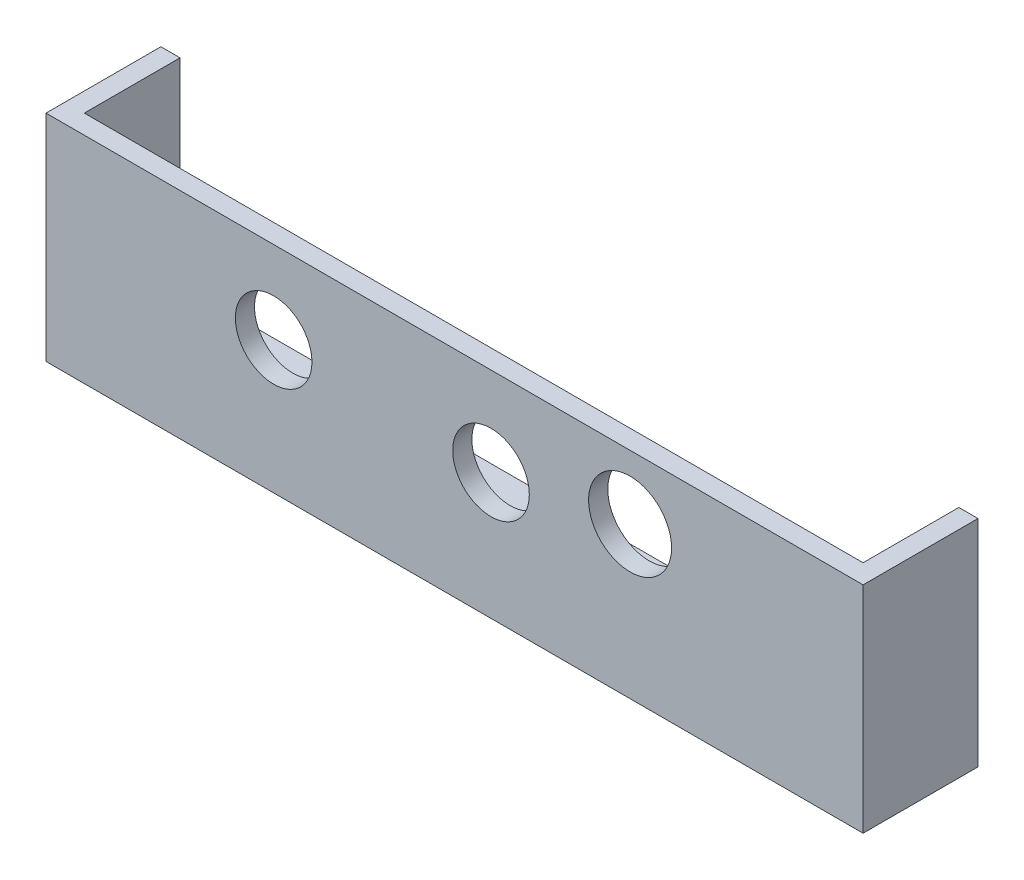
ISO-10303-21;
HEADER;
FILE_DESCRIPTION(('STEP AP214'),'2;1');
FILE_NAME('part.step','',(''),(''),'','','');
FILE_SCHEMA(('AUTOMOTIVE_DESIGN { 1 0 10303 214 1 1 1 1 }'));
ENDSEC;
DATA;
#1=APPLICATION_CONTEXT('core data for automotive mechanical design processes');
#2=APPLICATION_PROTOCOL_DEFINITION('international standard','automotive_design',2000,#1);
#3=PRODUCT_CONTEXT('',#1,'mechanical');
#4=PRODUCT('Part','Part','',(#3));
#5=PRODUCT_RELATED_PRODUCT_CATEGORY('part','',(#4));
#6=PRODUCT_DEFINITION_FORMATION('','',#4);
#7=PRODUCT_DEFINITION_CONTEXT('part definition',#1,'design');
#8=PRODUCT_DEFINITION('design','',#6,#7);
#9=PRODUCT_DEFINITION_SHAPE('','',#8);
#10=(LENGTH_UNIT() NAMED_UNIT(*) SI_UNIT(.MILLI.,.METRE.));
#11=(NAMED_UNIT(*) PLANE_ANGLE_UNIT() SI_UNIT($,.RADIAN.));
#12=(NAMED_UNIT(*) SI_UNIT($,.STERADIAN.) SOLID_ANGLE_UNIT());
#13=UNCERTAINTY_MEASURE_WITH_UNIT(LENGTH_MEASURE(1.E-05),#10,'distance_accuracy_value','');
#14=(GEOMETRIC_REPRESENTATION_CONTEXT(3) GLOBAL_UNCERTAINTY_ASSIGNED_CONTEXT((#13)) GLOBAL_UNIT_ASSIGNED_CONTEXT((#10,
#11,#12)) REPRESENTATION_CONTEXT('',''));
#15=CARTESIAN_POINT('',(0.,0.,0.));
#16=DIRECTION('',(0.,0.,1.));
#17=DIRECTION('',(1.,0.,0.));
#18=AXIS2_PLACEMENT_3D('',#15,#16,#17);
#19=CARTESIAN_POINT('',(0.,0.,0.));
#20=DIRECTION('',(0.,0.,1.));
#21=DIRECTION('',(1.,0.,0.));
#22=AXIS2_PLACEMENT_3D('',#19,#20,#21);
#23=PLANE('',#22);
#24=CARTESIAN_POINT('',(-59.3196683940109,-51.3800722070617,0.));
#25=DIRECTION('',(0.,0.,1.));
#26=DIRECTION('',(1.,0.,0.));
#27=AXIS2_PLACEMENT_3D('',#24,#25,#26);
#28=CIRCLE('',#27,6.);
#29=CARTESIAN_POINT('',(-53.3196683940109,-51.3800722070617,0.));
#30=VERTEX_POINT('',#29);
#31=EDGE_CURVE('E150',#30,#30,#28,.T.);
#32=ORIENTED_EDGE('',*,*,#31,.T.);
#33=EDGE_LOOP('',(#32));
#34=FACE_BOUND('',#33,.T.);
#35=CARTESIAN_POINT('',(-25.269668394011,-52.3300722070617,0.));
#36=DIRECTION('',(0.,0.,1.));
#37=DIRECTION('',(1.,0.,0.));
#38=AXIS2_PLACEMENT_3D('',#35,#36,#37);
#39=CIRCLE('',#38,6.);
#40=CARTESIAN_POINT('',(-19.269668394011,-52.3300722070617,0.));
#41=VERTEX_POINT('',#40);
#42=EDGE_CURVE('E154',#41,#41,#39,.T.);
#43=ORIENTED_EDGE('',*,*,#42,.T.);
#44=EDGE_LOOP('',(#43));
#45=FACE_BOUND('',#44,.T.);
#46=CARTESIAN_POINT('',(-3.4808099724207,-48.4300722070617,0.));
#47=DIRECTION('',(0.,0.,1.));
#48=DIRECTION('',(1.,0.,0.));
#49=AXIS2_PLACEMENT_3D('',#46,#47,#48);
#50=CIRCLE('',#49,6.5);
#51=CARTESIAN_POINT('',(3.0191900275793,-48.4300722070617,0.));
#52=VERTEX_POINT('',#51);
#53=EDGE_CURVE('E160',#52,#52,#50,.T.);
#54=ORIENTED_EDGE('',*,*,#53,.T.);
#55=EDGE_LOOP('',(#54));
#56=FACE_BOUND('',#55,.T.);
#57=DIRECTION('',(0.,1.,0.));
#58=VECTOR('',#57,1.);
#59=CARTESIAN_POINT('',(30.0191899286331,-69.1300722070617,0.));
#60=LINE('',#59,#58);
#61=CARTESIAN_POINT('',(30.0191899286331,-69.1300722070617,0.));
#62=VERTEX_POINT('',#61);
#63=CARTESIAN_POINT('',(30.0191899286331,-38.4300722070617,0.));
#64=VERTEX_POINT('',#63);
#65=EDGE_CURVE('E48',#62,#64,#60,.T.);
#66=ORIENTED_EDGE('',*,*,#65,.F.);
#67=DIRECTION('',(1.,0.,0.));
#68=VECTOR('',#67,1.);
#69=CARTESIAN_POINT('',(-91.9808100713669,-69.1300722070617,0.));
#70=LINE('',#69,#68);
#71=CARTESIAN_POINT('',(-91.9808100713669,-69.1300722070617,0.));
#72=VERTEX_POINT('',#71);
#73=EDGE_CURVE('E124',#72,#62,#70,.T.);
#74=ORIENTED_EDGE('',*,*,#73,.F.);
#75=DIRECTION('',(0.,-1.,0.));
#76=VECTOR('',#75,1.);
#77=CARTESIAN_POINT('',(-91.9808100713669,-38.4300722070617,0.));
#78=LINE('',#77,#76);
#79=CARTESIAN_POINT('',(-91.9808100713669,-38.4300722070617,0.));
#80=VERTEX_POINT('',#79);
#81=EDGE_CURVE('E53',#80,#72,#78,.T.);
#82=ORIENTED_EDGE('',*,*,#81,.F.);
#83=DIRECTION('',(-1.,0.,0.));
#84=VECTOR('',#83,1.);
#85=CARTESIAN_POINT('',(-94.9808100713669,-38.4300722070617,0.));
#86=LINE('',#85,#84);
#87=EDGE_CURVE('E166',#64,#80,#86,.T.);
#88=ORIENTED_EDGE('',*,*,#87,.F.);
#89=EDGE_LOOP('',(#66,#74,#82,#88));
#90=FACE_BOUND('',#89,.T.);
#91=ADVANCED_FACE('F33',(#34,#45,#56,#90),#23,.F.);
#92=CARTESIAN_POINT('',(0.,0.,3.));
#93=DIRECTION('',(0.,0.,1.));
#94=DIRECTION('',(1.,0.,0.));
#95=AXIS2_PLACEMENT_3D('',#92,#93,#94);
#96=PLANE('',#95);
#97=CARTESIAN_POINT('',(-25.269668394011,-52.3300722070617,3.));
#98=DIRECTION('',(0.,0.,1.));
#99=DIRECTION('',(1.,0.,0.));
#100=AXIS2_PLACEMENT_3D('',#97,#98,#99);
#101=CIRCLE('',#100,6.);
#102=CARTESIAN_POINT('',(-19.269668394011,-52.3300722070617,3.));
#103=VERTEX_POINT('',#102);
#104=EDGE_CURVE('E157',#103,#103,#101,.T.);
#105=ORIENTED_EDGE('',*,*,#104,.F.);
#106=EDGE_LOOP('',(#105));
#107=FACE_BOUND('',#106,.T.);
#108=DIRECTION('',(0.,-1.,0.));
#109=VECTOR('',#108,1.);
#110=CARTESIAN_POINT('',(-94.9808100713669,-38.4300722070617,3.));
#111=LINE('',#110,#109);
#112=CARTESIAN_POINT('',(-94.9808100713669,-38.4300722070617,3.));
#113=VERTEX_POINT('',#112);
#114=CARTESIAN_POINT('',(-94.9808100713669,-72.1300722070617,3.));
#115=VERTEX_POINT('',#114);
#116=EDGE_CURVE('E103',#113,#115,#111,.T.);
#117=ORIENTED_EDGE('',*,*,#116,.T.);
#118=DIRECTION('',(1.,0.,0.));
#119=VECTOR('',#118,1.);
#120=CARTESIAN_POINT('',(-94.9808100713669,-72.1300722070617,3.));
#121=LINE('',#120,#119);
#122=CARTESIAN_POINT('',(33.0191899286331,-72.1300722070617,3.));
#123=VERTEX_POINT('',#122);
#124=EDGE_CURVE('E170',#115,#123,#121,.T.);
#125=ORIENTED_EDGE('',*,*,#124,.T.);
#126=DIRECTION('',(0.,1.,0.));
#127=VECTOR('',#126,1.);
#128=CARTESIAN_POINT('',(33.0191899286331,-38.4300722070617,3.));
#129=LINE('',#128,#127);
#130=CARTESIAN_POINT('',(33.0191899286331,-38.4300722070617,3.));
#131=VERTEX_POINT('',#130);
#132=EDGE_CURVE('E172',#123,#131,#129,.T.);
#133=ORIENTED_EDGE('',*,*,#132,.T.);
#134=DIRECTION('',(-1.,0.,0.));
#135=VECTOR('',#134,1.);
#136=CARTESIAN_POINT('',(-94.9808100713669,-38.4300722070617,3.));
#137=LINE('',#136,#135);
#138=EDGE_CURVE('E107',#131,#113,#137,.T.);
#139=ORIENTED_EDGE('',*,*,#138,.T.);
#140=EDGE_LOOP('',(#117,#125,#133,#139));
#141=FACE_BOUND('',#140,.T.);
#142=CARTESIAN_POINT('',(-3.4808099724207,-48.4300722070617,3.));
#143=DIRECTION('',(0.,0.,1.));
#144=DIRECTION('',(1.,0.,0.));
#145=AXIS2_PLACEMENT_3D('',#142,#143,#144);
#146=CIRCLE('',#145,6.5);
#147=CARTESIAN_POINT('',(3.0191900275793,-48.4300722070617,3.));
#148=VERTEX_POINT('',#147);
#149=EDGE_CURVE('E163',#148,#148,#146,.T.);
#150=ORIENTED_EDGE('',*,*,#149,.F.);
#151=EDGE_LOOP('',(#150));
#152=FACE_BOUND('',#151,.T.);
#153=CARTESIAN_POINT('',(-59.3196683940109,-51.3800722070617,3.));
#154=DIRECTION('',(0.,0.,1.));
#155=DIRECTION('',(1.,0.,0.));
#156=AXIS2_PLACEMENT_3D('',#153,#154,#155);
#157=CIRCLE('',#156,6.);
#158=CARTESIAN_POINT('',(-53.3196683940109,-51.3800722070617,3.));
#159=VERTEX_POINT('',#158);
#160=EDGE_CURVE('E151',#159,#159,#157,.T.);
#161=ORIENTED_EDGE('',*,*,#160,.F.);
#162=EDGE_LOOP('',(#161));
#163=FACE_BOUND('',#162,.T.);
#164=ADVANCED_FACE('F186',(#107,#141,#152,#163),#96,.T.);
#165=CARTESIAN_POINT('',(-94.9808100713669,-38.4300722070617,3.));
#166=DIRECTION('',(1.,0.,0.));
#167=DIRECTION('',(0.,1.,0.));
#168=AXIS2_PLACEMENT_3D('',#165,#166,#167);
#169=PLANE('',#168);
#170=DIRECTION('',(0.,0.,-1.));
#171=VECTOR('',#170,1.);
#172=CARTESIAN_POINT('',(-94.9808100713669,-38.4300722070617,3.));
#173=LINE('',#172,#171);
#174=CARTESIAN_POINT('',(-94.9808100713669,-38.4300722070617,-15.));
#175=VERTEX_POINT('',#174);
#176=EDGE_CURVE('E97',#113,#175,#173,.T.);
#177=ORIENTED_EDGE('',*,*,#176,.T.);
#178=DIRECTION('',(0.,1.,0.));
#179=VECTOR('',#178,1.);
#180=CARTESIAN_POINT('',(-94.9808100713669,-38.4300722070617,-15.));
#181=LINE('',#180,#179);
#182=CARTESIAN_POINT('',(-94.9808100713669,-72.1300722070617,-15.));
#183=VERTEX_POINT('',#182);
#184=EDGE_CURVE('E101',#183,#175,#181,.T.);
#185=ORIENTED_EDGE('',*,*,#184,.F.);
#186=DIRECTION('',(0.,0.,-1.));
#187=VECTOR('',#186,1.);
#188=CARTESIAN_POINT('',(-94.9808100713669,-72.1300722070617,3.));
#189=LINE('',#188,#187);
#190=EDGE_CURVE('E11',#115,#183,#189,.T.);
#191=ORIENTED_EDGE('',*,*,#190,.F.);
#192=ORIENTED_EDGE('',*,*,#116,.F.);
#193=EDGE_LOOP('',(#177,#185,#191,#192));
#194=FACE_BOUND('',#193,.T.);
#195=ADVANCED_FACE('F35',(#194),#169,.F.);
#196=CARTESIAN_POINT('',(-94.9808100713669,-72.1300722070617,3.));
#197=DIRECTION('',(0.,1.,0.));
#198=DIRECTION('',(-1.,0.,0.));
#199=AXIS2_PLACEMENT_3D('',#196,#197,#198);
#200=PLANE('',#199);
#201=ORIENTED_EDGE('',*,*,#190,.T.);
#202=DIRECTION('',(-1.,0.,0.));
#203=VECTOR('',#202,1.);
#204=CARTESIAN_POINT('',(-94.9808100713669,-72.1300722070617,-15.));
#205=LINE('',#204,#203);
#206=CARTESIAN_POINT('',(33.0191899286331,-72.1300722070617,-15.));
#207=VERTEX_POINT('',#206);
#208=EDGE_CURVE('E122',#207,#183,#205,.T.);
#209=ORIENTED_EDGE('',*,*,#208,.F.);
#210=DIRECTION('',(0.,0.,-1.));
#211=VECTOR('',#210,1.);
#212=CARTESIAN_POINT('',(33.0191899286331,-72.1300722070617,3.));
#213=LINE('',#212,#211);
#214=EDGE_CURVE('E41',#123,#207,#213,.T.);
#215=ORIENTED_EDGE('',*,*,#214,.F.);
#216=ORIENTED_EDGE('',*,*,#124,.F.);
#217=EDGE_LOOP('',(#201,#209,#215,#216));
#218=FACE_BOUND('',#217,.T.);
#219=ADVANCED_FACE('F184',(#218),#200,.F.);
#220=CARTESIAN_POINT('',(33.0191899286331,-38.4300722070617,3.));
#221=DIRECTION('',(-1.,0.,0.));
#222=DIRECTION('',(0.,-1.,0.));
#223=AXIS2_PLACEMENT_3D('',#220,#221,#222);
#224=PLANE('',#223);
#225=ORIENTED_EDGE('',*,*,#214,.T.);
#226=DIRECTION('',(0.,-1.,0.));
#227=VECTOR('',#226,1.);
#228=CARTESIAN_POINT('',(33.0191899286331,-72.1300722070617,-15.));
#229=LINE('',#228,#227);
#230=CARTESIAN_POINT('',(33.0191899286331,-38.4300722070617,-15.));
#231=VERTEX_POINT('',#230);
#232=EDGE_CURVE('E135',#231,#207,#229,.T.);
#233=ORIENTED_EDGE('',*,*,#232,.F.);
#234=DIRECTION('',(0.,0.,-1.));
#235=VECTOR('',#234,1.);
#236=CARTESIAN_POINT('',(33.0191899286331,-38.4300722070617,3.));
#237=LINE('',#236,#235);
#238=EDGE_CURVE('E106',#131,#231,#237,.T.);
#239=ORIENTED_EDGE('',*,*,#238,.F.);
#240=ORIENTED_EDGE('',*,*,#132,.F.);
#241=EDGE_LOOP('',(#225,#233,#239,#240));
#242=FACE_BOUND('',#241,.T.);
#243=ADVANCED_FACE('F180',(#242),#224,.F.);
#244=CARTESIAN_POINT('',(-94.9808100713669,-38.4300722070617,3.));
#245=DIRECTION('',(0.,-1.,0.));
#246=DIRECTION('',(0.,0.,-1.));
#247=AXIS2_PLACEMENT_3D('',#244,#245,#246);
#248=PLANE('',#247);
#249=ORIENTED_EDGE('',*,*,#238,.T.);
#250=DIRECTION('',(1.,0.,0.));
#251=VECTOR('',#250,1.);
#252=CARTESIAN_POINT('',(33.0191899286331,-38.4300722070617,-15.));
#253=LINE('',#252,#251);
#254=CARTESIAN_POINT('',(30.0191899286331,-38.4300722070617,-15.));
#255=VERTEX_POINT('',#254);
#256=EDGE_CURVE('E132',#255,#231,#253,.T.);
#257=ORIENTED_EDGE('',*,*,#256,.F.);
#258=DIRECTION('',(0.,0.,1.));
#259=VECTOR('',#258,1.);
#260=CARTESIAN_POINT('',(30.0191899286331,-38.4300722070617,-15.));
#261=LINE('',#260,#259);
#262=EDGE_CURVE('E138',#255,#64,#261,.T.);
#263=ORIENTED_EDGE('',*,*,#262,.T.);
#264=ORIENTED_EDGE('',*,*,#87,.T.);
#265=DIRECTION('',(0.,0.,1.));
#266=VECTOR('',#265,1.);
#267=CARTESIAN_POINT('',(-91.9808100713669,-38.4300722070617,-15.));
#268=LINE('',#267,#266);
#269=CARTESIAN_POINT('',(-91.9808100713669,-38.4300722070617,-15.));
#270=VERTEX_POINT('',#269);
#271=EDGE_CURVE('E113',#270,#80,#268,.T.);
#272=ORIENTED_EDGE('',*,*,#271,.F.);
#273=DIRECTION('',(1.,0.,0.));
#274=VECTOR('',#273,1.);
#275=CARTESIAN_POINT('',(-91.9808100713669,-38.4300722070617,-15.));
#276=LINE('',#275,#274);
#277=EDGE_CURVE('E110',#175,#270,#276,.T.);
#278=ORIENTED_EDGE('',*,*,#277,.F.);
#279=ORIENTED_EDGE('',*,*,#176,.F.);
#280=ORIENTED_EDGE('',*,*,#138,.F.);
#281=EDGE_LOOP('',(#249,#257,#263,#264,#272,#278,#279,#280));
#282=FACE_BOUND('',#281,.T.);
#283=ADVANCED_FACE('F111',(#282),#248,.F.);
#284=CARTESIAN_POINT('',(-3.4808099724207,-48.4300722070617,3.));
#285=DIRECTION('',(0.,0.,-1.));
#286=DIRECTION('',(-1.,0.,0.));
#287=AXIS2_PLACEMENT_3D('',#284,#285,#286);
#288=CYLINDRICAL_SURFACE('',#287,6.5);
#289=ORIENTED_EDGE('',*,*,#149,.T.);
#290=EDGE_LOOP('',(#289));
#291=FACE_BOUND('',#290,.T.);
#292=ORIENTED_EDGE('',*,*,#53,.F.);
#293=EDGE_LOOP('',(#292));
#294=FACE_BOUND('',#293,.T.);
#295=ADVANCED_FACE('F223',(#291,#294),#288,.F.);
#296=CARTESIAN_POINT('',(-25.269668394011,-52.3300722070617,3.));
#297=DIRECTION('',(0.,0.,-1.));
#298=DIRECTION('',(-1.,0.,0.));
#299=AXIS2_PLACEMENT_3D('',#296,#297,#298);
#300=CYLINDRICAL_SURFACE('',#299,6.);
#301=ORIENTED_EDGE('',*,*,#104,.T.);
#302=EDGE_LOOP('',(#301));
#303=FACE_BOUND('',#302,.T.);
#304=ORIENTED_EDGE('',*,*,#42,.F.);
#305=EDGE_LOOP('',(#304));
#306=FACE_BOUND('',#305,.T.);
#307=ADVANCED_FACE('F207',(#303,#306),#300,.F.);
#308=CARTESIAN_POINT('',(-59.3196683940109,-51.3800722070617,3.));
#309=DIRECTION('',(0.,0.,-1.));
#310=DIRECTION('',(-1.,0.,0.));
#311=AXIS2_PLACEMENT_3D('',#308,#309,#310);
#312=CYLINDRICAL_SURFACE('',#311,6.);
#313=ORIENTED_EDGE('',*,*,#160,.T.);
#314=EDGE_LOOP('',(#313));
#315=FACE_BOUND('',#314,.T.);
#316=ORIENTED_EDGE('',*,*,#31,.F.);
#317=EDGE_LOOP('',(#316));
#318=FACE_BOUND('',#317,.T.);
#319=ADVANCED_FACE('F200',(#315,#318),#312,.F.);
#320=CARTESIAN_POINT('',(-91.9808100713669,-38.4300722070617,-15.));
#321=DIRECTION('',(-1.,0.,0.));
#322=DIRECTION('',(0.,-1.,0.));
#323=AXIS2_PLACEMENT_3D('',#320,#321,#322);
#324=PLANE('',#323);
#325=ORIENTED_EDGE('',*,*,#81,.T.);
#326=DIRECTION('',(0.,0.,1.));
#327=VECTOR('',#326,1.);
#328=CARTESIAN_POINT('',(-91.9808100713669,-69.1300722070617,-15.));
#329=LINE('',#328,#327);
#330=CARTESIAN_POINT('',(-91.9808100713669,-69.1300722070617,-15.));
#331=VERTEX_POINT('',#330);
#332=EDGE_CURVE('E146',#331,#72,#329,.T.);
#333=ORIENTED_EDGE('',*,*,#332,.F.);
#334=DIRECTION('',(0.,-1.,0.));
#335=VECTOR('',#334,1.);
#336=CARTESIAN_POINT('',(-91.9808100713669,-38.4300722070617,-15.));
#337=LINE('',#336,#335);
#338=EDGE_CURVE('E116',#270,#331,#337,.T.);
#339=ORIENTED_EDGE('',*,*,#338,.F.);
#340=ORIENTED_EDGE('',*,*,#271,.T.);
#341=EDGE_LOOP('',(#325,#333,#339,#340));
#342=FACE_BOUND('',#341,.T.);
#343=ADVANCED_FACE('F198',(#342),#324,.F.);
#344=CARTESIAN_POINT('',(-91.9808100713669,-69.1300722070617,-15.));
#345=DIRECTION('',(0.,-1.,0.));
#346=DIRECTION('',(1.,0.,0.));
#347=AXIS2_PLACEMENT_3D('',#344,#345,#346);
#348=PLANE('',#347);
#349=ORIENTED_EDGE('',*,*,#73,.T.);
#350=DIRECTION('',(0.,0.,1.));
#351=VECTOR('',#350,1.);
#352=CARTESIAN_POINT('',(30.0191899286331,-69.1300722070617,-15.));
#353=LINE('',#352,#351);
#354=CARTESIAN_POINT('',(30.0191899286331,-69.1300722070617,-15.));
#355=VERTEX_POINT('',#354);
#356=EDGE_CURVE('E143',#355,#62,#353,.T.);
#357=ORIENTED_EDGE('',*,*,#356,.F.);
#358=DIRECTION('',(1.,0.,0.));
#359=VECTOR('',#358,1.);
#360=CARTESIAN_POINT('',(-91.9808100713669,-69.1300722070617,-15.));
#361=LINE('',#360,#359);
#362=EDGE_CURVE('E128',#331,#355,#361,.T.);
#363=ORIENTED_EDGE('',*,*,#362,.F.);
#364=ORIENTED_EDGE('',*,*,#332,.T.);
#365=EDGE_LOOP('',(#349,#357,#363,#364));
#366=FACE_BOUND('',#365,.T.);
#367=ADVANCED_FACE('F195',(#366),#348,.F.);
#368=CARTESIAN_POINT('',(30.0191899286331,-69.1300722070617,-15.));
#369=DIRECTION('',(1.,0.,0.));
#370=DIRECTION('',(0.,1.,0.));
#371=AXIS2_PLACEMENT_3D('',#368,#369,#370);
#372=PLANE('',#371);
#373=ORIENTED_EDGE('',*,*,#65,.T.);
#374=ORIENTED_EDGE('',*,*,#262,.F.);
#375=DIRECTION('',(0.,1.,0.));
#376=VECTOR('',#375,1.);
#377=CARTESIAN_POINT('',(30.0191899286331,-69.1300722070617,-15.));
#378=LINE('',#377,#376);
#379=EDGE_CURVE('E130',#355,#255,#378,.T.);
#380=ORIENTED_EDGE('',*,*,#379,.F.);
#381=ORIENTED_EDGE('',*,*,#356,.T.);
#382=EDGE_LOOP('',(#373,#374,#380,#381));
#383=FACE_BOUND('',#382,.T.);
#384=ADVANCED_FACE('F191',(#383),#372,.F.);
#385=CARTESIAN_POINT('',(0.,0.,-15.));
#386=DIRECTION('',(0.,0.,1.));
#387=DIRECTION('',(1.,0.,0.));
#388=AXIS2_PLACEMENT_3D('',#385,#386,#387);
#389=PLANE('',#388);
#390=ORIENTED_EDGE('',*,*,#184,.T.);
#391=ORIENTED_EDGE('',*,*,#277,.T.);
#392=ORIENTED_EDGE('',*,*,#338,.T.);
#393=ORIENTED_EDGE('',*,*,#362,.T.);
#394=ORIENTED_EDGE('',*,*,#379,.T.);
#395=ORIENTED_EDGE('',*,*,#256,.T.);
#396=ORIENTED_EDGE('',*,*,#232,.T.);
#397=ORIENTED_EDGE('',*,*,#208,.T.);
#398=EDGE_LOOP('',(#390,#391,#392,#393,#394,#395,#396,#397));
#399=FACE_BOUND('',#398,.T.);
#400=ADVANCED_FACE('F119',(#399),#389,.F.);
#401=CLOSED_SHELL('',(#91,#164,#195,#219,#243,#283,#295,#307,#319,#343,#367,#384,#400));
#402=MANIFOLD_SOLID_BREP('B2',#401);
#403=ADVANCED_BREP_SHAPE_REPRESENTATION('',(#18,#402),#14);
#404=SHAPE_DEFINITION_REPRESENTATION(#9,#403);
ENDSEC;
END-ISO-10303-21;
